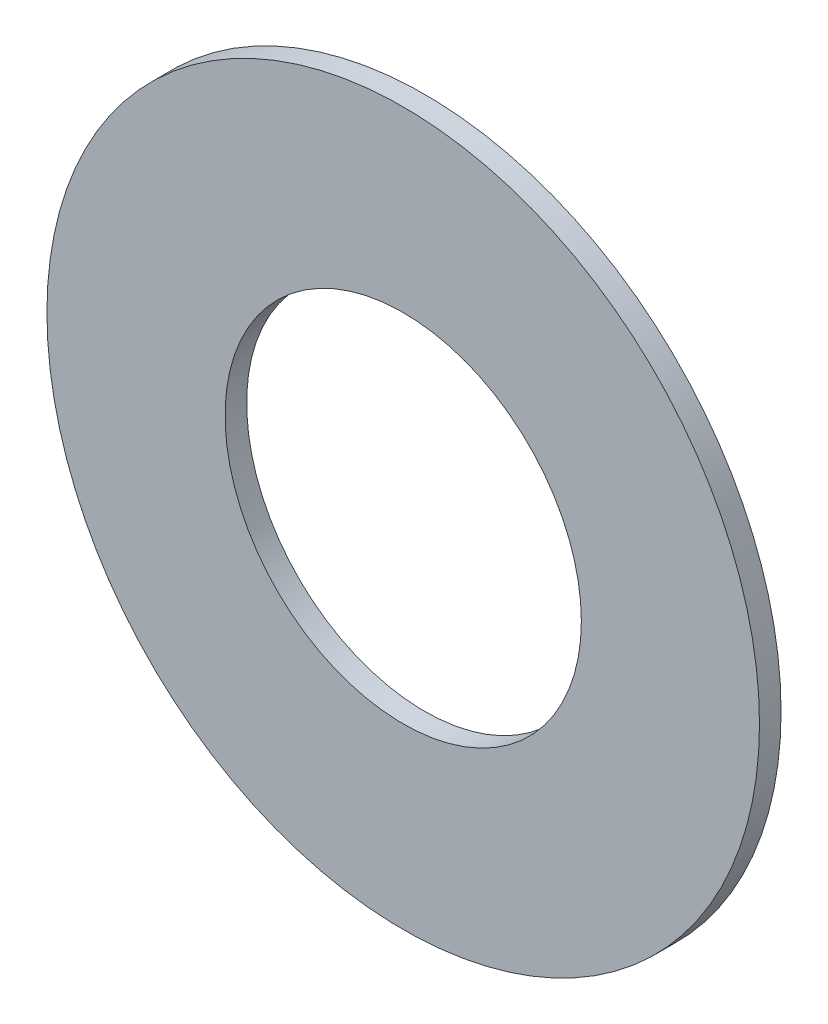
ISO-10303-21;
HEADER;
FILE_DESCRIPTION(('STEP AP214'),'2;1');
FILE_NAME('part.step','',(''),(''),'','','');
FILE_SCHEMA(('AUTOMOTIVE_DESIGN { 1 0 10303 214 1 1 1 1 }'));
ENDSEC;
DATA;
#1=APPLICATION_CONTEXT('core data for automotive mechanical design processes');
#2=APPLICATION_PROTOCOL_DEFINITION('international standard','automotive_design',2000,#1);
#3=PRODUCT_CONTEXT('',#1,'mechanical');
#4=PRODUCT('Part','Part','',(#3));
#5=PRODUCT_RELATED_PRODUCT_CATEGORY('part','',(#4));
#6=PRODUCT_DEFINITION_FORMATION('','',#4);
#7=PRODUCT_DEFINITION_CONTEXT('part definition',#1,'design');
#8=PRODUCT_DEFINITION('design','',#6,#7);
#9=PRODUCT_DEFINITION_SHAPE('','',#8);
#10=(LENGTH_UNIT() NAMED_UNIT(*) SI_UNIT(.MILLI.,.METRE.));
#11=(NAMED_UNIT(*) PLANE_ANGLE_UNIT() SI_UNIT($,.RADIAN.));
#12=(NAMED_UNIT(*) SI_UNIT($,.STERADIAN.) SOLID_ANGLE_UNIT());
#13=UNCERTAINTY_MEASURE_WITH_UNIT(LENGTH_MEASURE(1.E-05),#10,'distance_accuracy_value','');
#14=(GEOMETRIC_REPRESENTATION_CONTEXT(3) GLOBAL_UNCERTAINTY_ASSIGNED_CONTEXT((#13)) GLOBAL_UNIT_ASSIGNED_CONTEXT((#10,
#11,#12)) REPRESENTATION_CONTEXT('',''));
#15=CARTESIAN_POINT('',(0.,0.,0.));
#16=DIRECTION('',(0.,0.,1.));
#17=DIRECTION('',(1.,0.,0.));
#18=AXIS2_PLACEMENT_3D('',#15,#16,#17);
#19=CARTESIAN_POINT('',(0.,0.,2.));
#20=DIRECTION('',(0.,0.,1.));
#21=DIRECTION('',(1.,0.,0.));
#22=AXIS2_PLACEMENT_3D('',#19,#20,#21);
#23=PLANE('',#22);
#24=CARTESIAN_POINT('',(0.,0.,2.));
#25=DIRECTION('',(0.,0.,1.));
#26=DIRECTION('',(1.,0.,0.));
#27=AXIS2_PLACEMENT_3D('',#24,#25,#26);
#28=CIRCLE('',#27,33.);
#29=CARTESIAN_POINT('',(33.,0.,2.));
#30=VERTEX_POINT('',#29);
#31=EDGE_CURVE('E10',#30,#30,#28,.T.);
#32=ORIENTED_EDGE('',*,*,#31,.T.);
#33=EDGE_LOOP('',(#32));
#34=FACE_BOUND('',#33,.T.);
#35=CARTESIAN_POINT('',(0.,0.,2.));
#36=DIRECTION('',(0.,0.,1.));
#37=DIRECTION('',(1.,0.,0.));
#38=AXIS2_PLACEMENT_3D('',#35,#36,#37);
#39=CIRCLE('',#38,16.5);
#40=CARTESIAN_POINT('',(16.5,0.,2.));
#41=VERTEX_POINT('',#40);
#42=EDGE_CURVE('E38',#41,#41,#39,.T.);
#43=ORIENTED_EDGE('',*,*,#42,.F.);
#44=EDGE_LOOP('',(#43));
#45=FACE_BOUND('',#44,.T.);
#46=ADVANCED_FACE('F27',(#34,#45),#23,.T.);
#47=CARTESIAN_POINT('',(0.,0.,0.));
#48=DIRECTION('',(0.,0.,1.));
#49=DIRECTION('',(1.,0.,0.));
#50=AXIS2_PLACEMENT_3D('',#47,#48,#49);
#51=PLANE('',#50);
#52=CARTESIAN_POINT('',(0.,0.,0.));
#53=DIRECTION('',(0.,0.,1.));
#54=DIRECTION('',(1.,0.,0.));
#55=AXIS2_PLACEMENT_3D('',#52,#53,#54);
#56=CIRCLE('',#55,33.);
#57=CARTESIAN_POINT('',(33.,0.,0.));
#58=VERTEX_POINT('',#57);
#59=EDGE_CURVE('E34',#58,#58,#56,.T.);
#60=ORIENTED_EDGE('',*,*,#59,.F.);
#61=EDGE_LOOP('',(#60));
#62=FACE_BOUND('',#61,.T.);
#63=CARTESIAN_POINT('',(0.,0.,0.));
#64=DIRECTION('',(0.,0.,1.));
#65=DIRECTION('',(1.,0.,0.));
#66=AXIS2_PLACEMENT_3D('',#63,#64,#65);
#67=CIRCLE('',#66,16.5);
#68=CARTESIAN_POINT('',(16.5,0.,0.));
#69=VERTEX_POINT('',#68);
#70=EDGE_CURVE('E42',#69,#69,#67,.T.);
#71=ORIENTED_EDGE('',*,*,#70,.T.);
#72=EDGE_LOOP('',(#71));
#73=FACE_BOUND('',#72,.T.);
#74=ADVANCED_FACE('F48',(#62,#73),#51,.F.);
#75=CARTESIAN_POINT('',(0.,0.,2.));
#76=DIRECTION('',(0.,0.,-1.));
#77=DIRECTION('',(-1.,0.,0.));
#78=AXIS2_PLACEMENT_3D('',#75,#76,#77);
#79=CYLINDRICAL_SURFACE('',#78,33.);
#80=ORIENTED_EDGE('',*,*,#31,.F.);
#81=EDGE_LOOP('',(#80));
#82=FACE_BOUND('',#81,.T.);
#83=ORIENTED_EDGE('',*,*,#59,.T.);
#84=EDGE_LOOP('',(#83));
#85=FACE_BOUND('',#84,.T.);
#86=ADVANCED_FACE('F29',(#82,#85),#79,.T.);
#87=CARTESIAN_POINT('',(0.,0.,2.));
#88=DIRECTION('',(0.,0.,-1.));
#89=DIRECTION('',(-1.,0.,0.));
#90=AXIS2_PLACEMENT_3D('',#87,#88,#89);
#91=CYLINDRICAL_SURFACE('',#90,16.5);
#92=ORIENTED_EDGE('',*,*,#42,.T.);
#93=EDGE_LOOP('',(#92));
#94=FACE_BOUND('',#93,.T.);
#95=ORIENTED_EDGE('',*,*,#70,.F.);
#96=EDGE_LOOP('',(#95));
#97=FACE_BOUND('',#96,.T.);
#98=ADVANCED_FACE('F50',(#94,#97),#91,.F.);
#99=CLOSED_SHELL('',(#46,#74,#86,#98));
#100=MANIFOLD_SOLID_BREP('B2',#99);
#101=ADVANCED_BREP_SHAPE_REPRESENTATION('',(#18,#100),#14);
#102=SHAPE_DEFINITION_REPRESENTATION(#9,#101);
ENDSEC;
END-ISO-10303-21;
